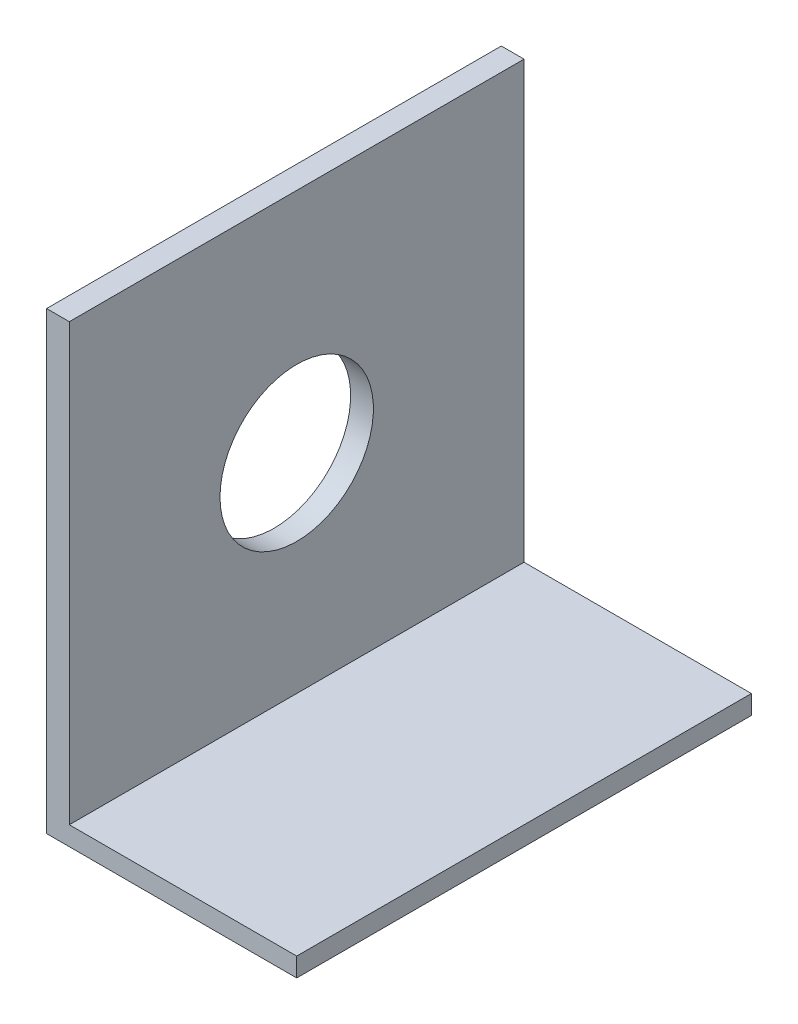
ISO-10303-21;
HEADER;
FILE_DESCRIPTION(('STEP AP214'),'2;1');
FILE_NAME('part.step','',(''),(''),'','','');
FILE_SCHEMA(('AUTOMOTIVE_DESIGN { 1 0 10303 214 1 1 1 1 }'));
ENDSEC;
DATA;
#1=APPLICATION_CONTEXT('core data for automotive mechanical design processes');
#2=APPLICATION_PROTOCOL_DEFINITION('international standard','automotive_design',2000,#1);
#3=PRODUCT_CONTEXT('',#1,'mechanical');
#4=PRODUCT('Part','Part','',(#3));
#5=PRODUCT_RELATED_PRODUCT_CATEGORY('part','',(#4));
#6=PRODUCT_DEFINITION_FORMATION('','',#4);
#7=PRODUCT_DEFINITION_CONTEXT('part definition',#1,'design');
#8=PRODUCT_DEFINITION('design','',#6,#7);
#9=PRODUCT_DEFINITION_SHAPE('','',#8);
#10=(LENGTH_UNIT() NAMED_UNIT(*) SI_UNIT(.MILLI.,.METRE.));
#11=(NAMED_UNIT(*) PLANE_ANGLE_UNIT() SI_UNIT($,.RADIAN.));
#12=(NAMED_UNIT(*) SI_UNIT($,.STERADIAN.) SOLID_ANGLE_UNIT());
#13=UNCERTAINTY_MEASURE_WITH_UNIT(LENGTH_MEASURE(1.E-05),#10,'distance_accuracy_value','');
#14=(GEOMETRIC_REPRESENTATION_CONTEXT(3) GLOBAL_UNCERTAINTY_ASSIGNED_CONTEXT((#13)) GLOBAL_UNIT_ASSIGNED_CONTEXT((#10,
#11,#12)) REPRESENTATION_CONTEXT('',''));
#15=CARTESIAN_POINT('',(0.,0.,0.));
#16=DIRECTION('',(0.,0.,1.));
#17=DIRECTION('',(1.,0.,0.));
#18=AXIS2_PLACEMENT_3D('',#15,#16,#17);
#19=CARTESIAN_POINT('',(-28.677527701918,27.1080139372822,40.));
#20=DIRECTION('',(1.,0.,0.));
#21=DIRECTION('',(0.,0.,-1.));
#22=AXIS2_PLACEMENT_3D('',#19,#20,#21);
#23=PLANE('',#22);
#24=CARTESIAN_POINT('',(-28.677527701918,7.10801393728223,20.));
#25=DIRECTION('',(-1.,0.,0.));
#26=DIRECTION('',(0.,0.,1.));
#27=AXIS2_PLACEMENT_3D('',#24,#25,#26);
#28=CIRCLE('',#27,6.74680534834509);
#29=CARTESIAN_POINT('',(-28.677527701918,7.10801393728223,26.7468053483451));
#30=VERTEX_POINT('',#29);
#31=EDGE_CURVE('E147',#30,#30,#28,.T.);
#32=ORIENTED_EDGE('',*,*,#31,.F.);
#33=EDGE_LOOP('',(#32));
#34=FACE_BOUND('',#33,.T.);
#35=DIRECTION('',(0.,-1.,0.));
#36=VECTOR('',#35,1.);
#37=CARTESIAN_POINT('',(-28.677527701918,27.1080139372822,0.));
#38=LINE('',#37,#36);
#39=CARTESIAN_POINT('',(-28.677527701918,27.1080139372822,0.));
#40=VERTEX_POINT('',#39);
#41=CARTESIAN_POINT('',(-28.677527701918,-12.8919860627178,0.));
#42=VERTEX_POINT('',#41);
#43=EDGE_CURVE('E122',#40,#42,#38,.T.);
#44=ORIENTED_EDGE('',*,*,#43,.T.);
#45=DIRECTION('',(0.,0.,-1.));
#46=VECTOR('',#45,1.);
#47=CARTESIAN_POINT('',(-28.677527701918,-12.8919860627178,40.));
#48=LINE('',#47,#46);
#49=CARTESIAN_POINT('',(-28.677527701918,-12.8919860627178,40.));
#50=VERTEX_POINT('',#49);
#51=EDGE_CURVE('E42',#50,#42,#48,.T.);
#52=ORIENTED_EDGE('',*,*,#51,.F.);
#53=DIRECTION('',(0.,-1.,0.));
#54=VECTOR('',#53,1.);
#55=CARTESIAN_POINT('',(-28.677527701918,27.1080139372822,40.));
#56=LINE('',#55,#54);
#57=CARTESIAN_POINT('',(-28.677527701918,27.1080139372822,40.));
#58=VERTEX_POINT('',#57);
#59=EDGE_CURVE('E88',#58,#50,#56,.T.);
#60=ORIENTED_EDGE('',*,*,#59,.F.);
#61=DIRECTION('',(0.,0.,-1.));
#62=VECTOR('',#61,1.);
#63=CARTESIAN_POINT('',(-28.677527701918,27.1080139372822,40.));
#64=LINE('',#63,#62);
#65=EDGE_CURVE('E11',#58,#40,#64,.T.);
#66=ORIENTED_EDGE('',*,*,#65,.T.);
#67=EDGE_LOOP('',(#44,#52,#60,#66));
#68=FACE_BOUND('',#67,.T.);
#69=ADVANCED_FACE('F33',(#34,#68),#23,.F.);
#70=CARTESIAN_POINT('',(-28.677527701918,-12.8919860627178,40.));
#71=DIRECTION('',(0.,1.,0.));
#72=DIRECTION('',(0.,0.,1.));
#73=AXIS2_PLACEMENT_3D('',#70,#71,#72);
#74=PLANE('',#73);
#75=DIRECTION('',(1.,0.,0.));
#76=VECTOR('',#75,1.);
#77=CARTESIAN_POINT('',(-28.677527701918,-12.8919860627178,0.));
#78=LINE('',#77,#76);
#79=CARTESIAN_POINT('',(-6.67752770191796,-12.8919860627178,0.));
#80=VERTEX_POINT('',#79);
#81=EDGE_CURVE('E124',#42,#80,#78,.T.);
#82=ORIENTED_EDGE('',*,*,#81,.T.);
#83=DIRECTION('',(0.,0.,-1.));
#84=VECTOR('',#83,1.);
#85=CARTESIAN_POINT('',(-6.67752770191796,-12.8919860627178,40.));
#86=LINE('',#85,#84);
#87=CARTESIAN_POINT('',(-6.67752770191796,-12.8919860627178,40.));
#88=VERTEX_POINT('',#87);
#89=EDGE_CURVE('E111',#88,#80,#86,.T.);
#90=ORIENTED_EDGE('',*,*,#89,.F.);
#91=DIRECTION('',(1.,0.,0.));
#92=VECTOR('',#91,1.);
#93=CARTESIAN_POINT('',(-28.677527701918,-12.8919860627178,40.));
#94=LINE('',#93,#92);
#95=EDGE_CURVE('E102',#50,#88,#94,.T.);
#96=ORIENTED_EDGE('',*,*,#95,.F.);
#97=ORIENTED_EDGE('',*,*,#51,.T.);
#98=EDGE_LOOP('',(#82,#90,#96,#97));
#99=FACE_BOUND('',#98,.T.);
#100=ADVANCED_FACE('F137',(#99),#74,.F.);
#101=CARTESIAN_POINT('',(-6.67752770191796,-12.8919860627178,40.));
#102=DIRECTION('',(-1.,0.,0.));
#103=DIRECTION('',(0.,0.,1.));
#104=AXIS2_PLACEMENT_3D('',#101,#102,#103);
#105=PLANE('',#104);
#106=DIRECTION('',(0.,1.,0.));
#107=VECTOR('',#106,1.);
#108=CARTESIAN_POINT('',(-6.67752770191796,-12.8919860627178,0.));
#109=LINE('',#108,#107);
#110=CARTESIAN_POINT('',(-6.67752770191796,-11.219512195122,0.));
#111=VERTEX_POINT('',#110);
#112=EDGE_CURVE('E110',#80,#111,#109,.T.);
#113=ORIENTED_EDGE('',*,*,#112,.T.);
#114=DIRECTION('',(0.,0.,-1.));
#115=VECTOR('',#114,1.);
#116=CARTESIAN_POINT('',(-6.67752770191796,-11.219512195122,40.));
#117=LINE('',#116,#115);
#118=CARTESIAN_POINT('',(-6.67752770191796,-11.219512195122,40.));
#119=VERTEX_POINT('',#118);
#120=EDGE_CURVE('E107',#119,#111,#117,.T.);
#121=ORIENTED_EDGE('',*,*,#120,.F.);
#122=DIRECTION('',(0.,1.,0.));
#123=VECTOR('',#122,1.);
#124=CARTESIAN_POINT('',(-6.67752770191796,-12.8919860627178,40.));
#125=LINE('',#124,#123);
#126=EDGE_CURVE('E96',#88,#119,#125,.T.);
#127=ORIENTED_EDGE('',*,*,#126,.F.);
#128=ORIENTED_EDGE('',*,*,#89,.T.);
#129=EDGE_LOOP('',(#113,#121,#127,#128));
#130=FACE_BOUND('',#129,.T.);
#131=ADVANCED_FACE('F108',(#130),#105,.F.);
#132=CARTESIAN_POINT('',(-6.67752770191796,-11.219512195122,40.));
#133=DIRECTION('',(0.,-1.,0.));
#134=DIRECTION('',(1.,0.,0.));
#135=AXIS2_PLACEMENT_3D('',#132,#133,#134);
#136=PLANE('',#135);
#137=DIRECTION('',(-1.,0.,0.));
#138=VECTOR('',#137,1.);
#139=CARTESIAN_POINT('',(-6.67752770191796,-11.219512195122,0.));
#140=LINE('',#139,#138);
#141=CARTESIAN_POINT('',(-26.677527701918,-11.219512195122,0.));
#142=VERTEX_POINT('',#141);
#143=EDGE_CURVE('E74',#111,#142,#140,.T.);
#144=ORIENTED_EDGE('',*,*,#143,.T.);
#145=DIRECTION('',(0.,0.,-1.));
#146=VECTOR('',#145,1.);
#147=CARTESIAN_POINT('',(-26.677527701918,-11.219512195122,40.));
#148=LINE('',#147,#146);
#149=CARTESIAN_POINT('',(-26.677527701918,-11.219512195122,40.));
#150=VERTEX_POINT('',#149);
#151=EDGE_CURVE('E112',#150,#142,#148,.T.);
#152=ORIENTED_EDGE('',*,*,#151,.F.);
#153=DIRECTION('',(-1.,0.,0.));
#154=VECTOR('',#153,1.);
#155=CARTESIAN_POINT('',(-6.67752770191796,-11.219512195122,40.));
#156=LINE('',#155,#154);
#157=EDGE_CURVE('E100',#119,#150,#156,.T.);
#158=ORIENTED_EDGE('',*,*,#157,.F.);
#159=ORIENTED_EDGE('',*,*,#120,.T.);
#160=EDGE_LOOP('',(#144,#152,#158,#159));
#161=FACE_BOUND('',#160,.T.);
#162=ADVANCED_FACE('F114',(#161),#136,.F.);
#163=CARTESIAN_POINT('',(-26.677527701918,-11.219512195122,40.));
#164=DIRECTION('',(-1.,0.,0.));
#165=DIRECTION('',(0.,0.,1.));
#166=AXIS2_PLACEMENT_3D('',#163,#164,#165);
#167=PLANE('',#166);
#168=CARTESIAN_POINT('',(-26.677527701918,7.10801393728223,20.));
#169=DIRECTION('',(-1.,0.,0.));
#170=DIRECTION('',(0.,0.,1.));
#171=AXIS2_PLACEMENT_3D('',#168,#169,#170);
#172=CIRCLE('',#171,6.74680534834509);
#173=CARTESIAN_POINT('',(-26.677527701918,7.10801393728223,26.7468053483451));
#174=VERTEX_POINT('',#173);
#175=EDGE_CURVE('E36',#174,#174,#172,.T.);
#176=ORIENTED_EDGE('',*,*,#175,.T.);
#177=EDGE_LOOP('',(#176));
#178=FACE_BOUND('',#177,.T.);
#179=DIRECTION('',(0.,1.,0.));
#180=VECTOR('',#179,1.);
#181=CARTESIAN_POINT('',(-26.677527701918,-11.219512195122,0.));
#182=LINE('',#181,#180);
#183=CARTESIAN_POINT('',(-26.677527701918,27.1080139372822,0.));
#184=VERTEX_POINT('',#183);
#185=EDGE_CURVE('E81',#142,#184,#182,.T.);
#186=ORIENTED_EDGE('',*,*,#185,.T.);
#187=DIRECTION('',(0.,0.,-1.));
#188=VECTOR('',#187,1.);
#189=CARTESIAN_POINT('',(-26.677527701918,27.1080139372822,40.));
#190=LINE('',#189,#188);
#191=CARTESIAN_POINT('',(-26.677527701918,27.1080139372822,40.));
#192=VERTEX_POINT('',#191);
#193=EDGE_CURVE('E118',#192,#184,#190,.T.);
#194=ORIENTED_EDGE('',*,*,#193,.F.);
#195=DIRECTION('',(0.,1.,0.));
#196=VECTOR('',#195,1.);
#197=CARTESIAN_POINT('',(-26.677527701918,-11.219512195122,40.));
#198=LINE('',#197,#196);
#199=EDGE_CURVE('E116',#150,#192,#198,.T.);
#200=ORIENTED_EDGE('',*,*,#199,.F.);
#201=ORIENTED_EDGE('',*,*,#151,.T.);
#202=EDGE_LOOP('',(#186,#194,#200,#201));
#203=FACE_BOUND('',#202,.T.);
#204=ADVANCED_FACE('F143',(#178,#203),#167,.F.);
#205=CARTESIAN_POINT('',(-26.677527701918,27.1080139372822,40.));
#206=DIRECTION('',(0.,-1.,0.));
#207=DIRECTION('',(0.,0.,-1.));
#208=AXIS2_PLACEMENT_3D('',#205,#206,#207);
#209=PLANE('',#208);
#210=DIRECTION('',(-1.,0.,0.));
#211=VECTOR('',#210,1.);
#212=CARTESIAN_POINT('',(-26.677527701918,27.1080139372822,0.));
#213=LINE('',#212,#211);
#214=EDGE_CURVE('E129',#184,#40,#213,.T.);
#215=ORIENTED_EDGE('',*,*,#214,.T.);
#216=ORIENTED_EDGE('',*,*,#65,.F.);
#217=DIRECTION('',(-1.,0.,0.));
#218=VECTOR('',#217,1.);
#219=CARTESIAN_POINT('',(-27.7019179458204,27.1080139372822,40.));
#220=LINE('',#219,#218);
#221=EDGE_CURVE('E50',#192,#58,#220,.T.);
#222=ORIENTED_EDGE('',*,*,#221,.F.);
#223=ORIENTED_EDGE('',*,*,#193,.T.);
#224=EDGE_LOOP('',(#215,#216,#222,#223));
#225=FACE_BOUND('',#224,.T.);
#226=ADVANCED_FACE('F142',(#225),#209,.F.);
#227=CARTESIAN_POINT('',(0.,0.,40.));
#228=DIRECTION('',(0.,0.,1.));
#229=DIRECTION('',(1.,0.,0.));
#230=AXIS2_PLACEMENT_3D('',#227,#228,#229);
#231=PLANE('',#230);
#232=ORIENTED_EDGE('',*,*,#221,.T.);
#233=ORIENTED_EDGE('',*,*,#59,.T.);
#234=ORIENTED_EDGE('',*,*,#95,.T.);
#235=ORIENTED_EDGE('',*,*,#126,.T.);
#236=ORIENTED_EDGE('',*,*,#157,.T.);
#237=ORIENTED_EDGE('',*,*,#199,.T.);
#238=EDGE_LOOP('',(#232,#233,#234,#235,#236,#237));
#239=FACE_BOUND('',#238,.T.);
#240=ADVANCED_FACE('F98',(#239),#231,.T.);
#241=CARTESIAN_POINT('',(0.,0.,0.));
#242=DIRECTION('',(0.,0.,1.));
#243=DIRECTION('',(1.,0.,0.));
#244=AXIS2_PLACEMENT_3D('',#241,#242,#243);
#245=PLANE('',#244);
#246=ORIENTED_EDGE('',*,*,#43,.F.);
#247=ORIENTED_EDGE('',*,*,#214,.F.);
#248=ORIENTED_EDGE('',*,*,#185,.F.);
#249=ORIENTED_EDGE('',*,*,#143,.F.);
#250=ORIENTED_EDGE('',*,*,#112,.F.);
#251=ORIENTED_EDGE('',*,*,#81,.F.);
#252=EDGE_LOOP('',(#246,#247,#248,#249,#250,#251));
#253=FACE_BOUND('',#252,.T.);
#254=ADVANCED_FACE('F140',(#253),#245,.F.);
#255=CARTESIAN_POINT('',(11.322472298082,7.10801393728223,20.));
#256=DIRECTION('',(-1.,0.,0.));
#257=DIRECTION('',(0.,0.,1.));
#258=AXIS2_PLACEMENT_3D('',#255,#256,#257);
#259=CYLINDRICAL_SURFACE('',#258,6.74680534834509);
#260=ORIENTED_EDGE('',*,*,#31,.T.);
#261=EDGE_LOOP('',(#260));
#262=FACE_BOUND('',#261,.T.);
#263=ORIENTED_EDGE('',*,*,#175,.F.);
#264=EDGE_LOOP('',(#263));
#265=FACE_BOUND('',#264,.T.);
#266=ADVANCED_FACE('F155',(#262,#265),#259,.F.);
#267=CLOSED_SHELL('',(#69,#100,#131,#162,#204,#226,#240,#254,#266));
#268=MANIFOLD_SOLID_BREP('B2',#267);
#269=ADVANCED_BREP_SHAPE_REPRESENTATION('',(#18,#268),#14);
#270=SHAPE_DEFINITION_REPRESENTATION(#9,#269);
ENDSEC;
END-ISO-10303-21;
